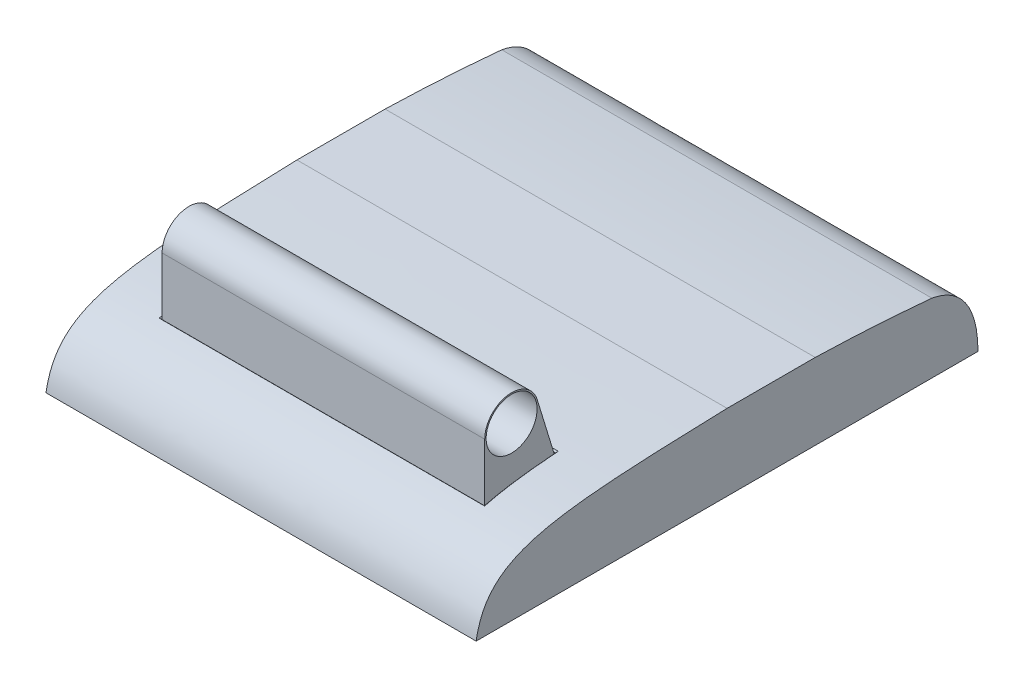
ISO-10303-21;
HEADER;
FILE_DESCRIPTION(('STEP AP214'),'2;1');
FILE_NAME('part.step','',(''),(''),'','','');
FILE_SCHEMA(('AUTOMOTIVE_DESIGN { 1 0 10303 214 1 1 1 1 }'));
ENDSEC;
DATA;
#1=APPLICATION_CONTEXT('core data for automotive mechanical design processes');
#2=APPLICATION_PROTOCOL_DEFINITION('international standard','automotive_design',2000,#1);
#3=PRODUCT_CONTEXT('',#1,'mechanical');
#4=PRODUCT('Part','Part','',(#3));
#5=PRODUCT_RELATED_PRODUCT_CATEGORY('part','',(#4));
#6=PRODUCT_DEFINITION_FORMATION('','',#4);
#7=PRODUCT_DEFINITION_CONTEXT('part definition',#1,'design');
#8=PRODUCT_DEFINITION('design','',#6,#7);
#9=PRODUCT_DEFINITION_SHAPE('','',#8);
#10=(LENGTH_UNIT() NAMED_UNIT(*) SI_UNIT(.MILLI.,.METRE.));
#11=(NAMED_UNIT(*) PLANE_ANGLE_UNIT() SI_UNIT($,.RADIAN.));
#12=(NAMED_UNIT(*) SI_UNIT($,.STERADIAN.) SOLID_ANGLE_UNIT());
#13=UNCERTAINTY_MEASURE_WITH_UNIT(LENGTH_MEASURE(1.E-05),#10,'distance_accuracy_value','');
#14=(GEOMETRIC_REPRESENTATION_CONTEXT(3) GLOBAL_UNCERTAINTY_ASSIGNED_CONTEXT((#13)) GLOBAL_UNIT_ASSIGNED_CONTEXT((#10,
#11,#12)) REPRESENTATION_CONTEXT('',''));
#15=CARTESIAN_POINT('',(0.,0.,0.));
#16=DIRECTION('',(0.,0.,1.));
#17=DIRECTION('',(1.,0.,0.));
#18=AXIS2_PLACEMENT_3D('',#15,#16,#17);
#19=CARTESIAN_POINT('',(57.15,8.85797491215105,41.513438472288));
#20=DIRECTION('',(1.,0.,0.));
#21=DIRECTION('',(0.,0.,-1.));
#22=AXIS2_PLACEMENT_3D('',#19,#20,#21);
#23=PLANE('',#22);
#24=DIRECTION('',(0.,0.956192058556992,0.292740067555745));
#25=VECTOR('',#24,1.);
#26=CARTESIAN_POINT('',(57.15,15.7318721958091,43.6178955603609));
#27=LINE('',#26,#25);
#28=CARTESIAN_POINT('',(57.15,8.85797491215105,41.513438472288));
#29=VERTEX_POINT('',#28);
#30=CARTESIAN_POINT('',(57.15,11.1077834958334,42.2022263105341));
#31=VERTEX_POINT('',#30);
#32=EDGE_CURVE('E55',#29,#31,#27,.T.);
#33=ORIENTED_EDGE('',*,*,#32,.T.);
#34=CARTESIAN_POINT('',(57.15,11.2761020846006,39.91725056572));
#35=CARTESIAN_POINT('',(57.1499999999999,10.9354105704601,44.7226887879077));
#36=CARTESIAN_POINT('',(57.15,10.5189607137835,49.5220720164187));
#37=CARTESIAN_POINT('',(57.15,9.25550876556452,59.1056426766938));
#38=CARTESIAN_POINT('',(57.15,8.43454184062688,63.8631526376391));
#39=CARTESIAN_POINT('',(57.15,7.08678698934591,68.4907685006036));
#40=B_SPLINE_CURVE_WITH_KNOTS('',3,(#34,#35,#36,#37,#38,#39),.UNSPECIFIED.,.F.,.F.,(4,2,4),
(0.0533160472173749,0.0677664345497455,0.0822168218821161),.UNSPECIFIED.);
#41=CARTESIAN_POINT('',(57.1500426719291,11.144971182818,41.7135683511645));
#42=VERTEX_POINT('',#41);
#43=EDGE_CURVE('E398',#31,#42,#40,.F.);
#44=ORIENTED_EDGE('',*,*,#43,.T.);
#45=DIRECTION('',(0.,0.996194698091747,0.0871557427476451));
#46=VECTOR('',#45,1.);
#47=CARTESIAN_POINT('',(57.15,8.85797491215105,41.513438472288));
#48=LINE('',#47,#46);
#49=EDGE_CURVE('E428',#29,#42,#48,.T.);
#50=ORIENTED_EDGE('',*,*,#49,.F.);
#51=EDGE_LOOP('',(#33,#44,#50));
#52=FACE_BOUND('',#51,.T.);
#53=ADVANCED_FACE('F37',(#52),#23,.F.);
#54=CARTESIAN_POINT('',(-57.15,8.85797491215105,41.513438472288));
#55=DIRECTION('',(-1.,0.,0.));
#56=DIRECTION('',(0.,0.,1.));
#57=AXIS2_PLACEMENT_3D('',#54,#55,#56);
#58=PLANE('',#57);
#59=DIRECTION('',(0.,0.956192058556992,0.292740067555745));
#60=VECTOR('',#59,1.);
#61=CARTESIAN_POINT('',(-57.15,15.7318721958091,43.6178955603609));
#62=LINE('',#61,#60);
#63=CARTESIAN_POINT('',(-57.15,8.85797491215105,41.513438472288));
#64=VERTEX_POINT('',#63);
#65=CARTESIAN_POINT('',(-57.15,11.107783442254,42.2022263063932));
#66=VERTEX_POINT('',#65);
#67=EDGE_CURVE('E182',#64,#66,#62,.T.);
#68=ORIENTED_EDGE('',*,*,#67,.F.);
#69=DIRECTION('',(0.,0.996194698091747,0.0871557427476451));
#70=VECTOR('',#69,1.);
#71=CARTESIAN_POINT('',(-57.15,8.85797491215105,41.513438472288));
#72=LINE('',#71,#70);
#73=CARTESIAN_POINT('',(-57.15,11.1449319441185,41.713521286556));
#74=VERTEX_POINT('',#73);
#75=EDGE_CURVE('E407',#64,#74,#72,.T.);
#76=ORIENTED_EDGE('',*,*,#75,.T.);
#77=CARTESIAN_POINT('',(-57.15,7.08678698934597,68.4907685006036));
#78=CARTESIAN_POINT('',(-57.15,8.43454184062693,63.8631526376391));
#79=CARTESIAN_POINT('',(-57.1500000000001,9.25550876556458,59.1056426766938));
#80=CARTESIAN_POINT('',(-57.15,10.5189607137836,49.5220720164188));
#81=CARTESIAN_POINT('',(-57.1500000000001,10.9354105704602,44.7226887879077));
#82=CARTESIAN_POINT('',(-57.15,11.2761020846006,39.91725056572));
#83=B_SPLINE_CURVE_WITH_KNOTS('',3,(#77,#78,#79,#80,#81,#82),.UNSPECIFIED.,.F.,.F.,(4,2,4),
(0.0533160472173749,0.0677664345497455,0.0822168218821161),.UNSPECIFIED.);
#84=EDGE_CURVE('E11',#74,#66,#83,.F.);
#85=ORIENTED_EDGE('',*,*,#84,.T.);
#86=EDGE_LOOP('',(#68,#76,#85));
#87=FACE_BOUND('',#86,.T.);
#88=ADVANCED_FACE('F242',(#87),#58,.F.);
#89=CARTESIAN_POINT('',(76.2,11.0144218529661,-72.5656027960115));
#90=CARTESIAN_POINT('',(76.2,12.3101742096925,-58.7355859131118));
#91=CARTESIAN_POINT('',(76.2,13.1366169253706,-44.9590301428867));
#92=CARTESIAN_POINT('',(76.2,13.49375,-31.2359354853511));
#93=B_SPLINE_CURVE_WITH_KNOTS('',3,(#89,#90,#91,#92),.UNSPECIFIED.,.F.,.F.,(4,4),(0.,
0.567867115464382),.UNSPECIFIED.);
#94=DIRECTION('',(-1.,0.,0.));
#95=VECTOR('',#94,1.);
#96=SURFACE_OF_LINEAR_EXTRUSION('',#93,#95);
#97=CARTESIAN_POINT('',(-76.2,11.0144218529661,-72.5656027960115));
#98=CARTESIAN_POINT('',(-76.2,12.3101742096925,-58.7355859131118));
#99=CARTESIAN_POINT('',(-76.2,13.1366169253706,-44.9590301428867));
#100=CARTESIAN_POINT('',(-76.2,13.49375,-31.2359354853511));
#101=B_SPLINE_CURVE_WITH_KNOTS('',3,(#97,#98,#99,#100),.UNSPECIFIED.,.F.,.F.,(4,4),(0.,
0.567867115464382),.UNSPECIFIED.);
#102=CARTESIAN_POINT('',(-76.2,11.0144218529661,-72.5656027960115));
#103=VERTEX_POINT('',#102);
#104=CARTESIAN_POINT('',(-76.2,13.49375,-31.2359354853511));
#105=VERTEX_POINT('',#104);
#106=EDGE_CURVE('E402',#103,#105,#101,.T.);
#107=ORIENTED_EDGE('',*,*,#106,.T.);
#108=DIRECTION('',(-1.,0.,0.));
#109=VECTOR('',#108,1.);
#110=CARTESIAN_POINT('',(76.2,13.49375,-31.2359354853511));
#111=LINE('',#110,#109);
#112=CARTESIAN_POINT('',(76.2,13.49375,-31.2359354853511));
#113=VERTEX_POINT('',#112);
#114=EDGE_CURVE('E535',#113,#105,#111,.T.);
#115=ORIENTED_EDGE('',*,*,#114,.F.);
#116=CARTESIAN_POINT('',(76.2,11.0144218529661,-72.5656027960115));
#117=VERTEX_POINT('',#116);
#118=EDGE_CURVE('E520',#117,#113,#93,.T.);
#119=ORIENTED_EDGE('',*,*,#118,.F.);
#120=DIRECTION('',(-1.,0.,0.));
#121=VECTOR('',#120,1.);
#122=CARTESIAN_POINT('',(76.2,11.0144218529661,-72.5656027960115));
#123=LINE('',#122,#121);
#124=EDGE_CURVE('E494',#117,#103,#123,.T.);
#125=ORIENTED_EDGE('',*,*,#124,.T.);
#126=EDGE_LOOP('',(#107,#115,#119,#125));
#127=FACE_BOUND('',#126,.T.);
#128=ADVANCED_FACE('F465',(#127),#96,.F.);
#129=CARTESIAN_POINT('',(76.2,13.49375,-31.2359354853511));
#130=DIRECTION('',(0.,-1.,0.));
#131=DIRECTION('',(0.,0.,-1.));
#132=AXIS2_PLACEMENT_3D('',#129,#130,#131);
#133=PLANE('',#132);
#134=DIRECTION('',(0.,0.,1.));
#135=VECTOR('',#134,1.);
#136=CARTESIAN_POINT('',(-76.2,13.49375,-31.2359354853511));
#137=LINE('',#136,#135);
#138=CARTESIAN_POINT('',(-76.2,13.49375,0.));
#139=VERTEX_POINT('',#138);
#140=EDGE_CURVE('E405',#105,#139,#137,.T.);
#141=ORIENTED_EDGE('',*,*,#140,.T.);
#142=DIRECTION('',(-1.,0.,0.));
#143=VECTOR('',#142,1.);
#144=CARTESIAN_POINT('',(76.2,13.49375,0.));
#145=LINE('',#144,#143);
#146=CARTESIAN_POINT('',(76.2,13.49375,0.));
#147=VERTEX_POINT('',#146);
#148=EDGE_CURVE('E532',#147,#139,#145,.T.);
#149=ORIENTED_EDGE('',*,*,#148,.F.);
#150=DIRECTION('',(0.,0.,1.));
#151=VECTOR('',#150,1.);
#152=CARTESIAN_POINT('',(76.2,13.49375,-31.2359354853511));
#153=LINE('',#152,#151);
#154=EDGE_CURVE('E561',#113,#147,#153,.T.);
#155=ORIENTED_EDGE('',*,*,#154,.F.);
#156=ORIENTED_EDGE('',*,*,#114,.T.);
#157=EDGE_LOOP('',(#141,#149,#155,#156));
#158=FACE_BOUND('',#157,.T.);
#159=ADVANCED_FACE('F554',(#158),#133,.F.);
#160=CARTESIAN_POINT('',(76.2,13.49375,0.));
#161=CARTESIAN_POINT('',(76.2,11.5296520395772,62.5886771182863));
#162=CARTESIAN_POINT('',(76.2,10.2758020262168,84.8329408744722));
#163=CARTESIAN_POINT('',(76.2,-13.4937500000001,88.9));
#164=B_SPLINE_CURVE_WITH_KNOTS('',3,(#160,#161,#162,#163),.UNSPECIFIED.,.F.,.F.,(4,4),(0.,1.),.UNSPECIFIED.);
#165=DIRECTION('',(-1.,0.,0.));
#166=VECTOR('',#165,1.);
#167=SURFACE_OF_LINEAR_EXTRUSION('',#164,#166);
#168=CARTESIAN_POINT('',(57.65,11.6800382848877,41.264673747373));
#169=CARTESIAN_POINT('',(57.65,10.8844625952114,52.002325221087));
#170=CARTESIAN_POINT('',(57.65,9.75365516016616,60.5842536716182));
#171=CARTESIAN_POINT('',(57.65,7.92547555060155,67.3560915702723));
#172=B_SPLINE_CURVE_WITH_KNOTS('',3,(#168,#169,#170,#171),.UNSPECIFIED.,.F.,.F.,(4,4),
(0.261841056485768,0.511665258364188),.UNSPECIFIED.);
#173=CARTESIAN_POINT('',(57.6499999999999,11.6799353333777,41.264666111741));
#174=VERTEX_POINT('',#173);
#175=CARTESIAN_POINT('',(57.65,7.92547555060155,67.3560915702723));
#176=VERTEX_POINT('',#175);
#177=EDGE_CURVE('E344',#174,#176,#172,.T.);
#178=ORIENTED_EDGE('',*,*,#177,.T.);
#179=DIRECTION('',(-1.,0.,0.));
#180=VECTOR('',#179,1.);
#181=CARTESIAN_POINT('',(57.6499999999999,7.92547559927862,67.3560913899655));
#182=LINE('',#181,#180);
#183=CARTESIAN_POINT('',(-57.6503790240608,7.92527574514703,67.3558533322455));
#184=VERTEX_POINT('',#183);
#185=EDGE_CURVE('E399',#176,#184,#182,.T.);
#186=ORIENTED_EDGE('',*,*,#185,.T.);
#187=CARTESIAN_POINT('',(-57.6499999999999,7.92547555060154,67.3560915702723));
#188=CARTESIAN_POINT('',(-57.6499999999999,9.75365516016616,60.5842536716182));
#189=CARTESIAN_POINT('',(-57.6499999999999,10.8844625952114,52.002325221087));
#190=CARTESIAN_POINT('',(-57.6499999999999,11.6800382848877,41.264673747373));
#191=B_SPLINE_CURVE_WITH_KNOTS('',3,(#187,#188,#189,#190),.UNSPECIFIED.,.F.,.F.,(4,4),
(0.261841056485768,0.511665258364188),.UNSPECIFIED.);
#192=CARTESIAN_POINT('',(-57.6500682143129,11.6800008441715,41.2647051566521));
#193=VERTEX_POINT('',#192);
#194=EDGE_CURVE('E330',#184,#193,#191,.T.);
#195=ORIENTED_EDGE('',*,*,#194,.T.);
#196=DIRECTION('',(-1.,0.,0.));
#197=VECTOR('',#196,1.);
#198=CARTESIAN_POINT('',(-57.6499999999999,11.6800382860273,41.2646737319927));
#199=LINE('',#198,#197);
#200=EDGE_CURVE('E543',#193,#174,#199,.F.);
#201=ORIENTED_EDGE('',*,*,#200,.T.);
#202=EDGE_LOOP('',(#178,#186,#195,#201));
#203=FACE_BOUND('',#202,.T.);
#204=CARTESIAN_POINT('',(-76.2,13.49375,0.));
#205=CARTESIAN_POINT('',(-76.2,11.5296520395772,62.5886771182863));
#206=CARTESIAN_POINT('',(-76.2,10.2758020262168,84.8329408744722));
#207=CARTESIAN_POINT('',(-76.2,-13.4937500000001,88.9));
#208=B_SPLINE_CURVE_WITH_KNOTS('',3,(#204,#205,#206,#207),.UNSPECIFIED.,.F.,.F.,(4,4),(0.,1.),.UNSPECIFIED.);
#209=CARTESIAN_POINT('',(-76.2,-13.4937500000001,88.9));
#210=VERTEX_POINT('',#209);
#211=EDGE_CURVE('E507',#139,#210,#208,.T.);
#212=ORIENTED_EDGE('',*,*,#211,.T.);
#213=DIRECTION('',(-1.,0.,0.));
#214=VECTOR('',#213,1.);
#215=CARTESIAN_POINT('',(76.2,-13.4937500000001,88.9));
#216=LINE('',#215,#214);
#217=CARTESIAN_POINT('',(76.2,-13.4937500000001,88.9));
#218=VERTEX_POINT('',#217);
#219=EDGE_CURVE('E529',#218,#210,#216,.T.);
#220=ORIENTED_EDGE('',*,*,#219,.F.);
#221=EDGE_CURVE('E556',#147,#218,#164,.T.);
#222=ORIENTED_EDGE('',*,*,#221,.F.);
#223=ORIENTED_EDGE('',*,*,#148,.T.);
#224=EDGE_LOOP('',(#212,#220,#222,#223));
#225=FACE_BOUND('',#224,.T.);
#226=ADVANCED_FACE('F545',(#203,#225),#167,.F.);
#227=CARTESIAN_POINT('',(76.2,-13.49375,-88.9));
#228=DIRECTION('',(0.,1.,0.));
#229=DIRECTION('',(0.,0.,1.));
#230=AXIS2_PLACEMENT_3D('',#227,#228,#229);
#231=PLANE('',#230);
#232=DIRECTION('',(0.,0.,-1.));
#233=VECTOR('',#232,1.);
#234=CARTESIAN_POINT('',(-76.2,-13.49375,-88.9));
#235=LINE('',#234,#233);
#236=CARTESIAN_POINT('',(-76.2,-13.49375,-88.9));
#237=VERTEX_POINT('',#236);
#238=EDGE_CURVE('E511',#210,#237,#235,.T.);
#239=ORIENTED_EDGE('',*,*,#238,.T.);
#240=DIRECTION('',(-1.,0.,0.));
#241=VECTOR('',#240,1.);
#242=CARTESIAN_POINT('',(76.2,-13.49375,-88.9));
#243=LINE('',#242,#241);
#244=CARTESIAN_POINT('',(76.2,-13.49375,-88.9));
#245=VERTEX_POINT('',#244);
#246=EDGE_CURVE('E526',#245,#237,#243,.T.);
#247=ORIENTED_EDGE('',*,*,#246,.F.);
#248=DIRECTION('',(0.,0.,-1.));
#249=VECTOR('',#248,1.);
#250=CARTESIAN_POINT('',(76.2,-13.49375,-88.9));
#251=LINE('',#250,#249);
#252=EDGE_CURVE('E495',#218,#245,#251,.T.);
#253=ORIENTED_EDGE('',*,*,#252,.F.);
#254=ORIENTED_EDGE('',*,*,#219,.T.);
#255=EDGE_LOOP('',(#239,#247,#253,#254));
#256=FACE_BOUND('',#255,.T.);
#257=ADVANCED_FACE('F486',(#256),#231,.F.);
#258=CARTESIAN_POINT('',(76.2,-13.49375,-88.9));
#259=CARTESIAN_POINT('',(76.2,1.24445012588154,-88.843676684604));
#260=CARTESIAN_POINT('',(76.2,9.17541746635728,-82.5618513005315));
#261=CARTESIAN_POINT('',(76.2,11.0144218529661,-72.5656027960115));
#262=B_SPLINE_CURVE_WITH_KNOTS('',3,(#258,#259,#260,#261),.UNSPECIFIED.,.F.,.F.,(4,4),(0.,1.),.UNSPECIFIED.);
#263=DIRECTION('',(-1.,0.,0.));
#264=VECTOR('',#263,1.);
#265=SURFACE_OF_LINEAR_EXTRUSION('',#262,#264);
#266=CARTESIAN_POINT('',(-76.2,-13.49375,-88.9));
#267=CARTESIAN_POINT('',(-76.2,1.24445012588154,-88.843676684604));
#268=CARTESIAN_POINT('',(-76.2,9.17541746635728,-82.5618513005315));
#269=CARTESIAN_POINT('',(-76.2,11.0144218529661,-72.5656027960115));
#270=B_SPLINE_CURVE_WITH_KNOTS('',3,(#266,#267,#268,#269),.UNSPECIFIED.,.F.,.F.,(4,4),(0.,1.),.UNSPECIFIED.);
#271=EDGE_CURVE('E516',#237,#103,#270,.T.);
#272=ORIENTED_EDGE('',*,*,#271,.T.);
#273=ORIENTED_EDGE('',*,*,#124,.F.);
#274=EDGE_CURVE('E489',#245,#117,#262,.T.);
#275=ORIENTED_EDGE('',*,*,#274,.F.);
#276=ORIENTED_EDGE('',*,*,#246,.T.);
#277=EDGE_LOOP('',(#272,#273,#275,#276));
#278=FACE_BOUND('',#277,.T.);
#279=ADVANCED_FACE('F479',(#278),#265,.F.);
#280=CARTESIAN_POINT('',(76.2,12.6060681572694,-51.8606733061698));
#281=DIRECTION('',(-1.,0.,0.));
#282=DIRECTION('',(0.,0.,1.));
#283=AXIS2_PLACEMENT_3D('',#280,#281,#282);
#284=PLANE('',#283);
#285=ORIENTED_EDGE('',*,*,#118,.T.);
#286=ORIENTED_EDGE('',*,*,#154,.T.);
#287=ORIENTED_EDGE('',*,*,#221,.T.);
#288=ORIENTED_EDGE('',*,*,#252,.T.);
#289=ORIENTED_EDGE('',*,*,#274,.T.);
#290=EDGE_LOOP('',(#285,#286,#287,#288,#289));
#291=FACE_BOUND('',#290,.T.);
#292=ADVANCED_FACE('F473',(#291),#284,.F.);
#293=CARTESIAN_POINT('',(-76.2,12.6060681572694,-51.8606733061698));
#294=DIRECTION('',(-1.,0.,0.));
#295=DIRECTION('',(0.,0.,1.));
#296=AXIS2_PLACEMENT_3D('',#293,#294,#295);
#297=PLANE('',#296);
#298=ORIENTED_EDGE('',*,*,#106,.F.);
#299=ORIENTED_EDGE('',*,*,#271,.F.);
#300=ORIENTED_EDGE('',*,*,#238,.F.);
#301=ORIENTED_EDGE('',*,*,#211,.F.);
#302=ORIENTED_EDGE('',*,*,#140,.F.);
#303=EDGE_LOOP('',(#298,#299,#300,#301,#302));
#304=FACE_BOUND('',#303,.T.);
#305=ADVANCED_FACE('F469',(#304),#297,.T.);
#306=CARTESIAN_POINT('',(57.15,11.2761020846006,39.91725056572));
#307=CARTESIAN_POINT('',(57.1499999999999,10.9354105704601,44.7226887879077));
#308=CARTESIAN_POINT('',(57.15,10.5189607137835,49.5220720164187));
#309=CARTESIAN_POINT('',(57.15,9.25550876556452,59.1056426766938));
#310=CARTESIAN_POINT('',(57.15,8.43454184062688,63.8631526376391));
#311=CARTESIAN_POINT('',(57.15,7.08678698934591,68.4907685006036));
#312=B_SPLINE_CURVE_WITH_KNOTS('',3,(#306,#307,#308,#309,#310,#311),.UNSPECIFIED.,.F.,.F.,(4,2,
4),(0.0533160472173749,0.0677664345497455,0.0822168218821161),.UNSPECIFIED.);
#313=CARTESIAN_POINT('',(57.1517792160607,7.53240763586932,66.892358148037));
#314=VERTEX_POINT('',#313);
#315=CARTESIAN_POINT('',(57.15,7.55048527160556,66.816782981714));
#316=VERTEX_POINT('',#315);
#317=EDGE_CURVE('E373',#314,#316,#312,.F.);
#318=ORIENTED_EDGE('',*,*,#317,.T.);
#319=DIRECTION('',(0.,1.,0.));
#320=VECTOR('',#319,1.);
#321=CARTESIAN_POINT('',(57.15,22.0347452146807,66.8167838038184));
#322=LINE('',#321,#320);
#323=CARTESIAN_POINT('',(57.15,6.64421904636087,66.8167838038184));
#324=VERTEX_POINT('',#323);
#325=EDGE_CURVE('E176',#324,#316,#322,.T.);
#326=ORIENTED_EDGE('',*,*,#325,.F.);
#327=DIRECTION('',(0.,0.996194698091747,0.0871557427476451));
#328=VECTOR('',#327,1.);
#329=CARTESIAN_POINT('',(57.15,6.64421904636087,66.8167838038184));
#330=LINE('',#329,#328);
#331=EDGE_CURVE('E394',#324,#314,#330,.T.);
#332=ORIENTED_EDGE('',*,*,#331,.T.);
#333=EDGE_LOOP('',(#318,#326,#332));
#334=FACE_BOUND('',#333,.T.);
#335=ADVANCED_FACE('F235',(#334),#23,.F.);
#336=CARTESIAN_POINT('',(-57.15,6.64421904636086,66.8167838038184));
#337=DIRECTION('',(0.,-0.087155742747645,0.996194698091747));
#338=DIRECTION('',(0.,-0.996194698091747,-0.087155742747645));
#339=AXIS2_PLACEMENT_3D('',#336,#337,#338);
#340=PLANE('',#339);
#341=DIRECTION('',(0.,0.996194698091747,0.0871557427476451));
#342=VECTOR('',#341,1.);
#343=CARTESIAN_POINT('',(-57.15,6.64421904636086,66.8167838038184));
#344=LINE('',#343,#342);
#345=CARTESIAN_POINT('',(-57.15,6.64421904636086,66.8167838038184));
#346=VERTEX_POINT('',#345);
#347=CARTESIAN_POINT('',(-57.15,7.53433841206602,66.8946591575025));
#348=VERTEX_POINT('',#347);
#349=EDGE_CURVE('E396',#346,#348,#344,.T.);
#350=ORIENTED_EDGE('',*,*,#349,.T.);
#351=DIRECTION('',(1.,0.,0.));
#352=VECTOR('',#351,1.);
#353=CARTESIAN_POINT('',(-57.15,7.53860089905799,66.8950320767927));
#354=LINE('',#353,#352);
#355=EDGE_CURVE('E392',#348,#314,#354,.T.);
#356=ORIENTED_EDGE('',*,*,#355,.T.);
#357=ORIENTED_EDGE('',*,*,#331,.F.);
#358=DIRECTION('',(1.,0.,0.));
#359=VECTOR('',#358,1.);
#360=CARTESIAN_POINT('',(-57.15,6.64421904636086,66.8167838038184));
#361=LINE('',#360,#359);
#362=EDGE_CURVE('E416',#346,#324,#361,.T.);
#363=ORIENTED_EDGE('',*,*,#362,.F.);
#364=EDGE_LOOP('',(#350,#356,#357,#363));
#365=FACE_BOUND('',#364,.T.);
#366=ADVANCED_FACE('F231',(#365),#340,.F.);
#367=ORIENTED_EDGE('',*,*,#349,.F.);
#368=DIRECTION('',(0.,1.,0.));
#369=VECTOR('',#368,1.);
#370=CARTESIAN_POINT('',(-57.15,22.0347452146807,66.8167838038184));
#371=LINE('',#370,#369);
#372=CARTESIAN_POINT('',(-57.15,7.55048839817328,66.8167838038184));
#373=VERTEX_POINT('',#372);
#374=EDGE_CURVE('E195',#346,#373,#371,.T.);
#375=ORIENTED_EDGE('',*,*,#374,.T.);
#376=CARTESIAN_POINT('',(-57.15,7.08678698934597,68.4907685006036));
#377=CARTESIAN_POINT('',(-57.15,8.43454184062693,63.8631526376391));
#378=CARTESIAN_POINT('',(-57.1500000000001,9.25550876556458,59.1056426766938));
#379=CARTESIAN_POINT('',(-57.15,10.5189607137836,49.5220720164188));
#380=CARTESIAN_POINT('',(-57.1500000000001,10.9354105704602,44.7226887879077));
#381=CARTESIAN_POINT('',(-57.15,11.2761020846006,39.91725056572));
#382=B_SPLINE_CURVE_WITH_KNOTS('',3,(#376,#377,#378,#379,#380,#381),.UNSPECIFIED.,.F.,.F.,(4,2,
4),(0.0533160472173749,0.0677664345497455,0.0822168218821161),.UNSPECIFIED.);
#383=EDGE_CURVE('E260',#373,#348,#382,.F.);
#384=ORIENTED_EDGE('',*,*,#383,.T.);
#385=EDGE_LOOP('',(#367,#375,#384));
#386=FACE_BOUND('',#385,.T.);
#387=ADVANCED_FACE('F234',(#386),#58,.F.);
#388=CARTESIAN_POINT('',(-57.15,8.85797491215105,41.513438472288));
#389=DIRECTION('',(0.,0.087155742747645,-0.996194698091747));
#390=DIRECTION('',(0.,0.996194698091747,0.087155742747645));
#391=AXIS2_PLACEMENT_3D('',#388,#389,#390);
#392=PLANE('',#391);
#393=ORIENTED_EDGE('',*,*,#49,.T.);
#394=DIRECTION('',(-1.,0.,0.));
#395=VECTOR('',#394,1.);
#396=CARTESIAN_POINT('',(-57.15,11.1451045985481,41.7135363918613));
#397=LINE('',#396,#395);
#398=EDGE_CURVE('E389',#42,#74,#397,.T.);
#399=ORIENTED_EDGE('',*,*,#398,.T.);
#400=ORIENTED_EDGE('',*,*,#75,.F.);
#401=DIRECTION('',(-1.,0.,0.));
#402=VECTOR('',#401,1.);
#403=CARTESIAN_POINT('',(-57.15,8.85797491215105,41.513438472288));
#404=LINE('',#403,#402);
#405=EDGE_CURVE('E438',#29,#64,#404,.T.);
#406=ORIENTED_EDGE('',*,*,#405,.F.);
#407=EDGE_LOOP('',(#393,#399,#400,#406));
#408=FACE_BOUND('',#407,.T.);
#409=ADVANCED_FACE('F240',(#408),#392,.F.);
#410=CARTESIAN_POINT('',(0.,11.6800382860273,41.2646737319927));
#411=DIRECTION('',(0.,0.642787609686977,0.766044443118611));
#412=DIRECTION('',(0.,-0.766044443118611,0.642787609686977));
#413=AXIS2_PLACEMENT_3D('',#410,#411,#412);
#414=PLANE('',#413);
#415=CARTESIAN_POINT('',(-57.1500853438582,11.1450104215175,41.7136154157729));
#416=CARTESIAN_POINT('',(-57.1709157672934,11.1673060875621,41.6949410801121));
#417=CARTESIAN_POINT('',(-57.1917455441411,11.1895996693834,41.6762635348326));
#418=CARTESIAN_POINT('',(-57.2334050979165,11.2341840678336,41.6389009009634));
#419=CARTESIAN_POINT('',(-57.2542348747641,11.2564748842056,41.620215811978));
#420=CARTESIAN_POINT('',(-57.2958944285684,11.3010537704808,41.5828381250683));
#421=CARTESIAN_POINT('',(-57.3167242054454,11.323341840129,41.5641455267513));
#422=CARTESIAN_POINT('',(-57.3583837593001,11.3679152517976,41.5267528551336));
#423=CARTESIAN_POINT('',(-57.3792135361986,11.390200593565,41.5080527814431));
#424=CARTESIAN_POINT('',(-57.4208730900985,11.4347685684415,41.4706451927022));
#425=CARTESIAN_POINT('',(-57.441702867021,11.4570512012994,41.4519376772646));
#426=CARTESIAN_POINT('',(-57.4833624209661,11.5016137774511,41.4145152382933));
#427=CARTESIAN_POINT('',(-57.5041921979101,11.5238937204954,41.3958003143751));
#428=CARTESIAN_POINT('',(-57.5458517519058,11.5684509362428,41.3583630913744));
#429=CARTESIAN_POINT('',(-57.5666815288793,11.5907282086981,41.3396407919099));
#430=CARTESIAN_POINT('',(-57.6083410829042,11.6352801026074,41.3021888503335));
#431=CARTESIAN_POINT('',(-57.6291708598775,11.6575547238153,41.2834592078421));
#432=CARTESIAN_POINT('',(-57.6499999999999,11.6798273481854,41.2647264830676));
#433=B_SPLINE_CURVE_WITH_KNOTS('',3,(#415,#416,#417,#418,#419,#420,#421,#422,#423,#424,#425,
#426,#427,#428,#429,#430,#431,#432),.UNSPECIFIED.,.F.,.F.,(4,2,2,2,2,2,2,2,4),(0.,
0.107320112965464,0.214646874108128,0.321980269614974,0.429320286382723,0.536666912018816,
0.644020134842399,0.751379943885191,0.858746328892521),.UNSPECIFIED.);
#434=EDGE_CURVE('E320',#74,#193,#433,.T.);
#435=ORIENTED_EDGE('',*,*,#434,.F.);
#436=ORIENTED_EDGE('',*,*,#398,.F.);
#437=CARTESIAN_POINT('',(57.6499999999999,11.6798223142625,41.2647944931346));
#438=CARTESIAN_POINT('',(57.6291708597579,11.6575498962752,41.2835243801885));
#439=CARTESIAN_POINT('',(57.6083410827844,11.6352754819768,41.3022511852735));
#440=CARTESIAN_POINT('',(57.5666815287593,11.59072400268,41.3396974530626));
#441=CARTESIAN_POINT('',(57.5458517517858,11.5684469379277,41.3584169161461));
#442=CARTESIAN_POINT('',(57.5041921977898,11.5238901383881,41.3958484674192));
#443=CARTESIAN_POINT('',(57.4833624208457,11.5016104038486,41.4145605559908));
#444=CARTESIAN_POINT('',(57.4417028669004,11.4570482455169,41.4519773253121));
#445=CARTESIAN_POINT('',(57.4208730899777,11.4347658219742,41.4706820064464));
#446=CARTESIAN_POINT('',(57.3792135360776,11.3901982665467,41.5080839276331));
#447=CARTESIAN_POINT('',(57.358383759179,11.3679131349131,41.5267811680726));
#448=CARTESIAN_POINT('',(57.316724205324,11.3233401443389,41.56416817425));
#449=CARTESIAN_POINT('',(57.2958944284468,11.3010522856514,41.5828579403778));
#450=CARTESIAN_POINT('',(57.2542348746422,11.2564738221328,41.62022996398));
#451=CARTESIAN_POINT('',(57.2334050977944,11.2341832175566,41.6389122218471));
#452=CARTESIAN_POINT('',(57.1917455440188,11.1895992435415,41.6762691945605));
#453=CARTESIAN_POINT('',(57.1709157671709,11.1673058743592,41.6949439098023));
#454=CARTESIAN_POINT('',(57.1500853438582,11.1450104215175,41.7136154157729));
#455=B_SPLINE_CURVE_WITH_KNOTS('',3,(#437,#438,#439,#440,#441,#442,#443,#444,#445,#446,#447,
#448,#449,#450,#451,#452,#453,#454),.UNSPECIFIED.,.F.,.F.,(4,2,2,2,2,2,2,2,4),(0.,
0.107361544132795,0.214716513832746,0.322064898848741,0.429406688216461,0.536741870259309,
0.644070432589354,0.751392362108316,0.858707645008478),.UNSPECIFIED.);
#456=EDGE_CURVE('E355',#174,#42,#455,.T.);
#457=ORIENTED_EDGE('',*,*,#456,.F.);
#458=ORIENTED_EDGE('',*,*,#200,.F.);
#459=EDGE_LOOP('',(#435,#436,#457,#458));
#460=FACE_BOUND('',#459,.T.);
#461=ADVANCED_FACE('F39',(#460),#414,.T.);
#462=CARTESIAN_POINT('',(57.6499999999999,11.7748649441076,39.9524018100275));
#463=CARTESIAN_POINT('',(57.6499999999999,11.4336940599225,44.7642493573374));
#464=CARTESIAN_POINT('',(57.6499999999999,11.0167983980046,49.5720579180498));
#465=CARTESIAN_POINT('',(57.6499999999999,9.74915520146433,59.1858844201614));
#466=CARTESIAN_POINT('',(57.6499999999999,8.92564010347298,63.9642298105774));
#467=CARTESIAN_POINT('',(57.6499999999999,7.56657677383532,68.6314872367392));
#468=CARTESIAN_POINT('',(57.15,11.2761020846006,39.91725056572));
#469=CARTESIAN_POINT('',(57.1499999999999,10.9354105704601,44.7226887879077));
#470=CARTESIAN_POINT('',(57.15,10.5189607137835,49.5220720164187));
#471=CARTESIAN_POINT('',(57.15,9.25550876556452,59.1056426766938));
#472=CARTESIAN_POINT('',(57.15,8.43454184062688,63.8631526376391));
#473=CARTESIAN_POINT('',(57.15,7.08678698934591,68.4907685006036));
#474=B_SPLINE_SURFACE_WITH_KNOTS('',1,3,((#462,#463,#464,#465,#466,#467),(#468,#469,#470,#471,
#472,#473)),.UNSPECIFIED.,.F.,.F.,.F.,(2,2),(4,2,4),(0.,1.),(0.0533160472173749,
0.0677664345497455,0.0822168218821161),.UNSPECIFIED.);
#475=CARTESIAN_POINT('',(57.15,11.2761020846006,39.91725056572));
#476=CARTESIAN_POINT('',(57.1499999999999,10.9354105704601,44.7226887879077));
#477=CARTESIAN_POINT('',(57.15,10.5189607137835,49.5220720164187));
#478=CARTESIAN_POINT('',(57.15,9.25550876556452,59.1056426766938));
#479=CARTESIAN_POINT('',(57.15,8.43454184062688,63.8631526376391));
#480=CARTESIAN_POINT('',(57.15,7.08678698934591,68.4907685006036));
#481=B_SPLINE_CURVE_WITH_KNOTS('',3,(#475,#476,#477,#478,#479,#480),.UNSPECIFIED.,.F.,.F.,(4,2,
4),(0.0533160472173749,0.0677664345497455,0.0822168218821161),.UNSPECIFIED.);
#482=EDGE_CURVE('E61',#316,#31,#481,.F.);
#483=CARTESIAN_POINT('',(57.1535584321214,7.53473934666461,66.8904300578618));
#484=CARTESIAN_POINT('',(57.174245551833,7.55103855399173,66.9097079628445));
#485=CARTESIAN_POINT('',(57.1949306225884,7.56732823359542,66.928996122304));
#486=CARTESIAN_POINT('',(57.2363007649277,7.59989170210724,66.9675968713494));
#487=CARTESIAN_POINT('',(57.2569858356864,7.61616548719138,66.9869094650455));
#488=CARTESIAN_POINT('',(57.2983559780878,7.64869709564457,67.0255591941756));
#489=CARTESIAN_POINT('',(57.3190410488917,7.66495491513878,67.0448963337689));
#490=CARTESIAN_POINT('',(57.3604111913861,7.69745452111671,67.0835952666257));
#491=CARTESIAN_POINT('',(57.3810962622238,7.71369630367413,67.1029570640983));
#492=CARTESIAN_POINT('',(57.4224664048041,7.74616376427504,67.1417054250075));
#493=CARTESIAN_POINT('',(57.4431514756796,7.76238943834014,67.1610919927032));
#494=CARTESIAN_POINT('',(57.4845216183462,7.79482461022255,67.1998900066996));
#495=CARTESIAN_POINT('',(57.5052066892558,7.81103410400876,67.2193014573101));
#496=CARTESIAN_POINT('',(57.5465768320168,7.84343684339072,67.2581493501398));
#497=CARTESIAN_POINT('',(57.5672619029722,7.85963008490203,67.27758579672));
#498=CARTESIAN_POINT('',(57.6086320457975,7.89200024751875,67.3164837948077));
#499=CARTESIAN_POINT('',(57.6293171167564,7.90817716448572,67.3359453507278));
#500=CARTESIAN_POINT('',(57.6499999999999,7.92434417464525,67.3554174558583));
#501=B_SPLINE_CURVE_WITH_KNOTS('',3,(#483,#484,#485,#486,#487,#488,#489,#490,#491,#492,#493,
#494,#495,#496,#497,#498,#499,#500),.UNSPECIFIED.,.F.,.F.,(4,2,2,2,2,2,2,2,4),(0.,
0.0979149005424559,0.195849358986927,0.29380354161296,0.391777615961247,0.489771750841138,
0.58778611633819,0.685820883821519,0.783876225951548),.UNSPECIFIED.);
#502=EDGE_CURVE('E175',#176,#314,#501,.F.);
#503=ORIENTED_EDGE('',*,*,#456,.T.);
#504=ORIENTED_EDGE('',*,*,#43,.F.);
#505=ORIENTED_EDGE('',*,*,#482,.F.);
#506=ORIENTED_EDGE('',*,*,#317,.F.);
#507=ORIENTED_EDGE('',*,*,#502,.F.);
#508=ORIENTED_EDGE('',*,*,#177,.F.);
#509=EDGE_LOOP('',(#503,#504,#505,#506,#507,#508));
#510=FACE_BOUND('',#509,.T.);
#511=ADVANCED_FACE('F287',(#510),#474,.T.);
#512=CARTESIAN_POINT('',(-57.15,11.2761020846006,39.91725056572));
#513=CARTESIAN_POINT('',(-57.1500000000001,10.9354105704602,44.7226887879077));
#514=CARTESIAN_POINT('',(-57.15,10.5189607137836,49.5220720164188));
#515=CARTESIAN_POINT('',(-57.1500000000001,9.25550876556458,59.1056426766938));
#516=CARTESIAN_POINT('',(-57.15,8.43454184062693,63.8631526376391));
#517=CARTESIAN_POINT('',(-57.15,7.08678698934597,68.4907685006036));
#518=CARTESIAN_POINT('',(-57.6499999999999,11.7748649441076,39.9524018100275));
#519=CARTESIAN_POINT('',(-57.65,11.4336940599225,44.7642493573373));
#520=CARTESIAN_POINT('',(-57.6499999999999,11.0167983980046,49.5720579180498));
#521=CARTESIAN_POINT('',(-57.65,9.74915520146434,59.1858844201614));
#522=CARTESIAN_POINT('',(-57.6499999999999,8.92564010347296,63.9642298105774));
#523=CARTESIAN_POINT('',(-57.6499999999999,7.56657677383532,68.6314872367392));
#524=B_SPLINE_SURFACE_WITH_KNOTS('',1,3,((#512,#513,#514,#515,#516,#517),(#518,#519,#520,#521,
#522,#523)),.UNSPECIFIED.,.F.,.F.,.F.,(2,2),(4,2,4),(0.,1.),(0.0533160472173749,
0.0677664345497455,0.0822168218821161),.UNSPECIFIED.);
#525=CARTESIAN_POINT('',(-57.6499999999999,7.92434417464524,67.3554174558583));
#526=CARTESIAN_POINT('',(-57.6293803765856,7.90822651992052,67.3360052495232));
#527=CARTESIAN_POINT('',(-57.6087585789043,7.89209901926328,67.316603527801));
#528=CARTESIAN_POINT('',(-57.5675149826426,7.85982778941509,67.2778250444752));
#529=CARTESIAN_POINT('',(-57.5468931849648,7.84368406432454,67.2584482784994));
#530=CARTESIAN_POINT('',(-57.5056495887665,7.81138045726829,67.219719594286));
#531=CARTESIAN_POINT('',(-57.4850277911338,7.79522057934967,67.2003676717272));
#532=CARTESIAN_POINT('',(-57.4437841950288,7.76288473802513,67.1616885622794));
#533=CARTESIAN_POINT('',(-57.4231623974299,7.74670877861359,67.1423613711198));
#534=CARTESIAN_POINT('',(-57.3819188014102,7.71434084548356,67.103731612761));
#535=CARTESIAN_POINT('',(-57.3612970038486,7.69814887570738,67.0844290413413));
#536=CARTESIAN_POINT('',(-57.3200534079136,7.66574899279959,67.0458484110973));
#537=CARTESIAN_POINT('',(-57.2994316103855,7.64954108355885,67.026570348102));
#538=CARTESIAN_POINT('',(-57.2581880145424,7.61710939246672,66.9880386236996));
#539=CARTESIAN_POINT('',(-57.2375662170589,7.60088561445536,66.9687849581705));
#540=CARTESIAN_POINT('',(-57.1963226212772,7.56842225629311,66.9303019180112));
#541=CARTESIAN_POINT('',(-57.1757008237969,7.55218267993202,66.9110725393075));
#542=CARTESIAN_POINT('',(-57.155076989543,7.53593363325058,66.8918533531891));
#543=B_SPLINE_CURVE_WITH_KNOTS('',3,(#525,#526,#527,#528,#529,#530,#531,#532,#533,#534,#535,
#536,#537,#538,#539,#540,#541,#542),.UNSPECIFIED.,.F.,.F.,(4,2,2,2,2,2,2,2,4),(0.,
0.097754959460342,0.19548947033764,0.293203703707555,0.39089782937032,0.488572015858126,
0.586226430442582,0.683861239142104,0.781476606729222),.UNSPECIFIED.);
#544=EDGE_CURVE('E173',#348,#184,#543,.F.);
#545=CARTESIAN_POINT('',(-57.15,7.08678698934597,68.4907685006036));
#546=CARTESIAN_POINT('',(-57.15,8.43454184062693,63.8631526376391));
#547=CARTESIAN_POINT('',(-57.1500000000001,9.25550876556458,59.1056426766938));
#548=CARTESIAN_POINT('',(-57.15,10.5189607137836,49.5220720164188));
#549=CARTESIAN_POINT('',(-57.1500000000001,10.9354105704602,44.7226887879077));
#550=CARTESIAN_POINT('',(-57.15,11.2761020846006,39.91725056572));
#551=B_SPLINE_CURVE_WITH_KNOTS('',3,(#545,#546,#547,#548,#549,#550),.UNSPECIFIED.,.F.,.F.,(4,2,
4),(0.0533160472173749,0.0677664345497455,0.0822168218821161),.UNSPECIFIED.);
#552=EDGE_CURVE('E48',#66,#373,#551,.F.);
#553=ORIENTED_EDGE('',*,*,#434,.T.);
#554=ORIENTED_EDGE('',*,*,#194,.F.);
#555=ORIENTED_EDGE('',*,*,#544,.F.);
#556=ORIENTED_EDGE('',*,*,#383,.F.);
#557=ORIENTED_EDGE('',*,*,#552,.F.);
#558=ORIENTED_EDGE('',*,*,#84,.F.);
#559=EDGE_LOOP('',(#553,#554,#555,#556,#557,#558));
#560=FACE_BOUND('',#559,.T.);
#561=ADVANCED_FACE('F276',(#560),#524,.T.);
#562=CARTESIAN_POINT('',(0.,7.92547559927861,67.3560913899655));
#563=DIRECTION('',(0.,-0.766044442639237,0.642787610258273));
#564=DIRECTION('',(0.,-0.642787610258273,-0.766044442639237));
#565=AXIS2_PLACEMENT_3D('',#562,#563,#564);
#566=PLANE('',#565);
#567=ORIENTED_EDGE('',*,*,#502,.T.);
#568=ORIENTED_EDGE('',*,*,#355,.F.);
#569=ORIENTED_EDGE('',*,*,#544,.T.);
#570=ORIENTED_EDGE('',*,*,#185,.F.);
#571=EDGE_LOOP('',(#567,#568,#569,#570));
#572=FACE_BOUND('',#571,.T.);
#573=ADVANCED_FACE('F227',(#572),#566,.F.);
#574=CARTESIAN_POINT('',(57.15,15.7318721958091,43.6178955603609));
#575=DIRECTION('',(0.,-0.292740067555745,0.956192058556992));
#576=DIRECTION('',(0.,-0.956192058556992,-0.292740067555745));
#577=AXIS2_PLACEMENT_3D('',#574,#575,#576);
#578=PLANE('',#577);
#579=ORIENTED_EDGE('',*,*,#67,.T.);
#580=CARTESIAN_POINT('',(-57.15,31.1479966515492,48.3375721925133));
#581=VERTEX_POINT('',#580);
#582=EDGE_CURVE('E171',#66,#581,#62,.T.);
#583=ORIENTED_EDGE('',*,*,#582,.T.);
#584=DIRECTION('',(-1.,0.,0.));
#585=VECTOR('',#584,1.);
#586=CARTESIAN_POINT('',(57.15,31.1479966515492,48.3375721925133));
#587=LINE('',#586,#585);
#588=CARTESIAN_POINT('',(57.15,31.1479966515492,48.3375721925133));
#589=VERTEX_POINT('',#588);
#590=EDGE_CURVE('E163',#589,#581,#587,.T.);
#591=ORIENTED_EDGE('',*,*,#590,.F.);
#592=EDGE_CURVE('E148',#31,#589,#27,.T.);
#593=ORIENTED_EDGE('',*,*,#592,.F.);
#594=ORIENTED_EDGE('',*,*,#32,.F.);
#595=ORIENTED_EDGE('',*,*,#405,.T.);
#596=EDGE_LOOP('',(#579,#583,#591,#593,#594,#595));
#597=FACE_BOUND('',#596,.T.);
#598=ADVANCED_FACE('F169',(#597),#578,.F.);
#599=CARTESIAN_POINT('',(57.15,27.9002713830004,57.2917838038184));
#600=DIRECTION('',(-1.,0.,0.));
#601=DIRECTION('',(0.,0.,1.));
#602=AXIS2_PLACEMENT_3D('',#599,#600,#601);
#603=CYLINDRICAL_SURFACE('',#602,9.52500000000001);
#604=CARTESIAN_POINT('',(-57.15,27.9002713830004,57.2917838038184));
#605=DIRECTION('',(1.,0.,0.));
#606=DIRECTION('',(0.,0.,-1.));
#607=AXIS2_PLACEMENT_3D('',#604,#605,#606);
#608=CIRCLE('',#607,9.52500000000001);
#609=CARTESIAN_POINT('',(-57.15,27.9002713830004,66.8167838038184));
#610=VERTEX_POINT('',#609);
#611=EDGE_CURVE('E189',#581,#610,#608,.T.);
#612=ORIENTED_EDGE('',*,*,#611,.T.);
#613=DIRECTION('',(-1.,0.,0.));
#614=VECTOR('',#613,1.);
#615=CARTESIAN_POINT('',(57.15,27.9002713830004,66.8167838038184));
#616=LINE('',#615,#614);
#617=CARTESIAN_POINT('',(57.15,27.9002713830004,66.8167838038184));
#618=VERTEX_POINT('',#617);
#619=EDGE_CURVE('E165',#618,#610,#616,.T.);
#620=ORIENTED_EDGE('',*,*,#619,.F.);
#621=CARTESIAN_POINT('',(57.15,27.9002713830004,57.2917838038184));
#622=DIRECTION('',(1.,0.,0.));
#623=DIRECTION('',(0.,0.,-1.));
#624=AXIS2_PLACEMENT_3D('',#621,#622,#623);
#625=CIRCLE('',#624,9.52500000000001);
#626=EDGE_CURVE('E152',#589,#618,#625,.T.);
#627=ORIENTED_EDGE('',*,*,#626,.F.);
#628=ORIENTED_EDGE('',*,*,#590,.T.);
#629=EDGE_LOOP('',(#612,#620,#627,#628));
#630=FACE_BOUND('',#629,.T.);
#631=ADVANCED_FACE('F162',(#630),#603,.T.);
#632=CARTESIAN_POINT('',(57.15,22.0347452146807,66.8167838038184));
#633=DIRECTION('',(0.,0.,1.));
#634=DIRECTION('',(1.,0.,0.));
#635=AXIS2_PLACEMENT_3D('',#632,#633,#634);
#636=PLANE('',#635);
#637=ORIENTED_EDGE('',*,*,#374,.F.);
#638=ORIENTED_EDGE('',*,*,#362,.T.);
#639=ORIENTED_EDGE('',*,*,#325,.T.);
#640=EDGE_CURVE('E166',#316,#618,#322,.T.);
#641=ORIENTED_EDGE('',*,*,#640,.T.);
#642=ORIENTED_EDGE('',*,*,#619,.T.);
#643=EDGE_CURVE('E191',#373,#610,#371,.T.);
#644=ORIENTED_EDGE('',*,*,#643,.F.);
#645=EDGE_LOOP('',(#637,#638,#639,#641,#642,#644));
#646=FACE_BOUND('',#645,.T.);
#647=ADVANCED_FACE('F218',(#646),#636,.T.);
#648=CARTESIAN_POINT('',(57.15,27.9002713830004,57.2917838038184));
#649=DIRECTION('',(-1.,0.,0.));
#650=DIRECTION('',(0.,0.,1.));
#651=AXIS2_PLACEMENT_3D('',#648,#649,#650);
#652=CYLINDRICAL_SURFACE('',#651,9.025);
#653=CARTESIAN_POINT('',(57.15,27.9002713830004,57.2917838038184));
#654=DIRECTION('',(1.,0.,0.));
#655=DIRECTION('',(0.,0.,-1.));
#656=AXIS2_PLACEMENT_3D('',#653,#654,#655);
#657=CIRCLE('',#656,9.025);
#658=CARTESIAN_POINT('',(57.15,27.9002713830004,48.2667838038184));
#659=VERTEX_POINT('',#658);
#660=EDGE_CURVE('E157',#659,#659,#657,.T.);
#661=ORIENTED_EDGE('',*,*,#660,.T.);
#662=EDGE_LOOP('',(#661));
#663=FACE_BOUND('',#662,.T.);
#664=CARTESIAN_POINT('',(-57.15,27.9002713830004,57.2917838038184));
#665=DIRECTION('',(1.,0.,0.));
#666=DIRECTION('',(0.,0.,-1.));
#667=AXIS2_PLACEMENT_3D('',#664,#665,#666);
#668=CIRCLE('',#667,9.025);
#669=CARTESIAN_POINT('',(-57.15,27.9002713830004,48.2667838038184));
#670=VERTEX_POINT('',#669);
#671=EDGE_CURVE('E183',#670,#670,#668,.T.);
#672=ORIENTED_EDGE('',*,*,#671,.F.);
#673=EDGE_LOOP('',(#672));
#674=FACE_BOUND('',#673,.T.);
#675=ADVANCED_FACE('F221',(#663,#674),#652,.F.);
#676=CARTESIAN_POINT('',(57.15,22.0347452146807,23.0304946724026));
#677=DIRECTION('',(1.,0.,0.));
#678=DIRECTION('',(0.,0.,-1.));
#679=AXIS2_PLACEMENT_3D('',#676,#677,#678);
#680=PLANE('',#679);
#681=ORIENTED_EDGE('',*,*,#660,.F.);
#682=EDGE_LOOP('',(#681));
#683=FACE_BOUND('',#682,.T.);
#684=ORIENTED_EDGE('',*,*,#640,.F.);
#685=ORIENTED_EDGE('',*,*,#482,.T.);
#686=ORIENTED_EDGE('',*,*,#592,.T.);
#687=ORIENTED_EDGE('',*,*,#626,.T.);
#688=EDGE_LOOP('',(#684,#685,#686,#687));
#689=FACE_BOUND('',#688,.T.);
#690=ADVANCED_FACE('F151',(#683,#689),#680,.T.);
#691=CARTESIAN_POINT('',(-57.15,22.0347452146807,23.0304946724026));
#692=DIRECTION('',(1.,0.,0.));
#693=DIRECTION('',(0.,0.,-1.));
#694=AXIS2_PLACEMENT_3D('',#691,#692,#693);
#695=PLANE('',#694);
#696=ORIENTED_EDGE('',*,*,#552,.T.);
#697=ORIENTED_EDGE('',*,*,#643,.T.);
#698=ORIENTED_EDGE('',*,*,#611,.F.);
#699=ORIENTED_EDGE('',*,*,#582,.F.);
#700=EDGE_LOOP('',(#696,#697,#698,#699));
#701=FACE_BOUND('',#700,.T.);
#702=ORIENTED_EDGE('',*,*,#671,.T.);
#703=EDGE_LOOP('',(#702));
#704=FACE_BOUND('',#703,.T.);
#705=ADVANCED_FACE('F207',(#701,#704),#695,.F.);
#706=CLOSED_SHELL('',(#53,#88,#128,#159,#226,#257,#279,#292,#305,#335,#366,#387,#409,#461,#511,
#561,#573,#598,#631,#647,#675,#690,#705));
#707=MANIFOLD_SOLID_BREP('B2',#706);
#708=ADVANCED_BREP_SHAPE_REPRESENTATION('',(#18,#707),#14);
#709=SHAPE_DEFINITION_REPRESENTATION(#9,#708);
ENDSEC;
END-ISO-10303-21;
